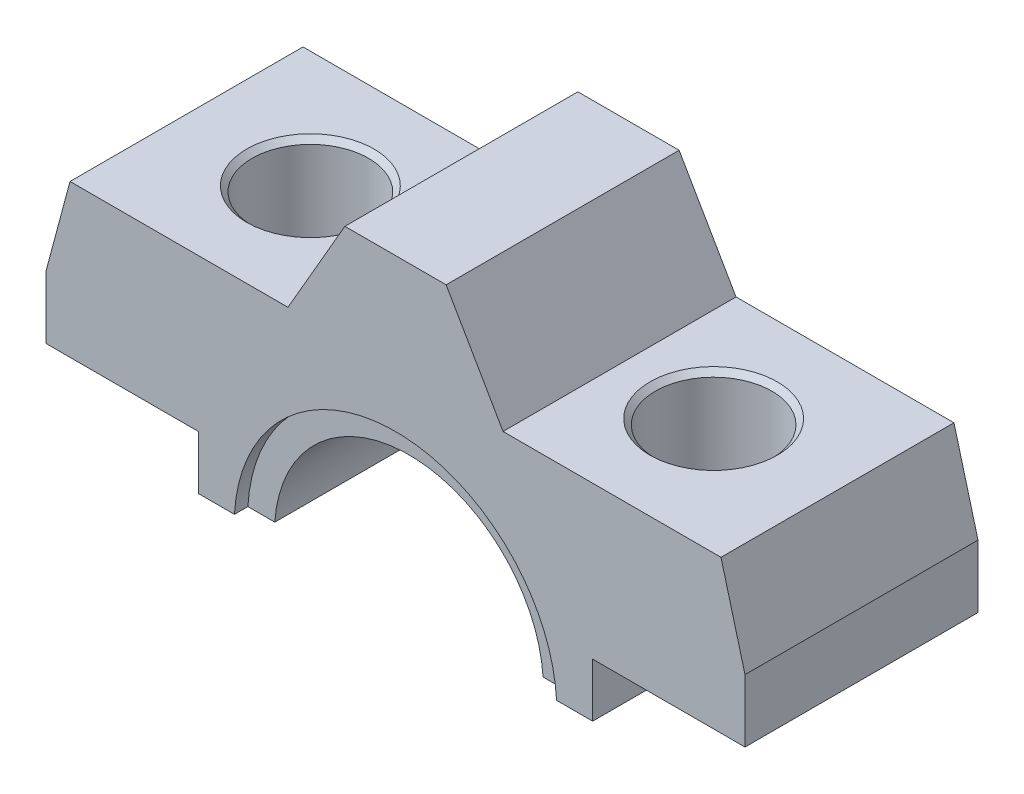
ISO-10303-21;
HEADER;
FILE_DESCRIPTION(('STEP AP214'),'2;1');
FILE_NAME('part.step','',(''),(''),'','','');
FILE_SCHEMA(('AUTOMOTIVE_DESIGN { 1 0 10303 214 1 1 1 1 }'));
ENDSEC;
DATA;
#1=APPLICATION_CONTEXT('core data for automotive mechanical design processes');
#2=APPLICATION_PROTOCOL_DEFINITION('international standard','automotive_design',2000,#1);
#3=PRODUCT_CONTEXT('',#1,'mechanical');
#4=PRODUCT('Part','Part','',(#3));
#5=PRODUCT_RELATED_PRODUCT_CATEGORY('part','',(#4));
#6=PRODUCT_DEFINITION_FORMATION('','',#4);
#7=PRODUCT_DEFINITION_CONTEXT('part definition',#1,'design');
#8=PRODUCT_DEFINITION('design','',#6,#7);
#9=PRODUCT_DEFINITION_SHAPE('','',#8);
#10=(LENGTH_UNIT() NAMED_UNIT(*) SI_UNIT(.MILLI.,.METRE.));
#11=(NAMED_UNIT(*) PLANE_ANGLE_UNIT() SI_UNIT($,.RADIAN.));
#12=(NAMED_UNIT(*) SI_UNIT($,.STERADIAN.) SOLID_ANGLE_UNIT());
#13=UNCERTAINTY_MEASURE_WITH_UNIT(LENGTH_MEASURE(1.E-05),#10,'distance_accuracy_value','');
#14=(GEOMETRIC_REPRESENTATION_CONTEXT(3) GLOBAL_UNCERTAINTY_ASSIGNED_CONTEXT((#13)) GLOBAL_UNIT_ASSIGNED_CONTEXT((#10,
#11,#12)) REPRESENTATION_CONTEXT('',''));
#15=CARTESIAN_POINT('',(0.,0.,0.));
#16=DIRECTION('',(0.,0.,1.));
#17=DIRECTION('',(1.,0.,0.));
#18=AXIS2_PLACEMENT_3D('',#15,#16,#17);
#19=CARTESIAN_POINT('',(22.,1.,-26.));
#20=DIRECTION('',(1.,0.,0.));
#21=DIRECTION('',(0.,0.,-1.));
#22=AXIS2_PLACEMENT_3D('',#19,#20,#21);
#23=PLANE('',#22);
#24=DIRECTION('',(0.,1.,0.));
#25=VECTOR('',#24,1.);
#26=CARTESIAN_POINT('',(22.,1.,-19.4807406984079));
#27=LINE('',#26,#25);
#28=CARTESIAN_POINT('',(22.,1.,-19.4807406984079));
#29=VERTEX_POINT('',#28);
#30=CARTESIAN_POINT('',(22.,7.,-19.4807406984079));
#31=VERTEX_POINT('',#30);
#32=EDGE_CURVE('E197',#29,#31,#27,.T.);
#33=ORIENTED_EDGE('',*,*,#32,.F.);
#34=DIRECTION('',(0.,0.,1.));
#35=VECTOR('',#34,1.);
#36=CARTESIAN_POINT('',(22.,1.,-26.));
#37=LINE('',#36,#35);
#38=CARTESIAN_POINT('',(22.,1.,-26.));
#39=VERTEX_POINT('',#38);
#40=EDGE_CURVE('E207',#39,#29,#37,.T.);
#41=ORIENTED_EDGE('',*,*,#40,.F.);
#42=DIRECTION('',(0.,1.,0.));
#43=VECTOR('',#42,1.);
#44=CARTESIAN_POINT('',(22.,1.,-26.));
#45=LINE('',#44,#43);
#46=CARTESIAN_POINT('',(22.,7.,-26.));
#47=VERTEX_POINT('',#46);
#48=EDGE_CURVE('E418',#39,#47,#45,.T.);
#49=ORIENTED_EDGE('',*,*,#48,.T.);
#50=DIRECTION('',(0.,0.,1.));
#51=VECTOR('',#50,1.);
#52=CARTESIAN_POINT('',(22.,7.,-26.));
#53=LINE('',#52,#51);
#54=EDGE_CURVE('E209',#47,#31,#53,.T.);
#55=ORIENTED_EDGE('',*,*,#54,.T.);
#56=EDGE_LOOP('',(#33,#41,#49,#55));
#57=FACE_BOUND('',#56,.T.);
#58=ADVANCED_FACE('F35',(#57),#23,.T.);
#59=CARTESIAN_POINT('',(-22.,7.,-26.));
#60=DIRECTION('',(-1.,0.,0.));
#61=DIRECTION('',(0.,0.,1.));
#62=AXIS2_PLACEMENT_3D('',#59,#60,#61);
#63=PLANE('',#62);
#64=DIRECTION('',(0.,1.,0.));
#65=VECTOR('',#64,1.);
#66=CARTESIAN_POINT('',(-22.,1.,-6.51925930159214));
#67=LINE('',#66,#65);
#68=CARTESIAN_POINT('',(-22.,1.,-6.51925930159214));
#69=VERTEX_POINT('',#68);
#70=CARTESIAN_POINT('',(-22.,7.,-6.51925930159214));
#71=VERTEX_POINT('',#70);
#72=EDGE_CURVE('E58',#69,#71,#67,.T.);
#73=ORIENTED_EDGE('',*,*,#72,.F.);
#74=DIRECTION('',(0.,0.,1.));
#75=VECTOR('',#74,1.);
#76=CARTESIAN_POINT('',(-22.,1.,-26.));
#77=LINE('',#76,#75);
#78=CARTESIAN_POINT('',(-22.,1.,0.));
#79=VERTEX_POINT('',#78);
#80=EDGE_CURVE('E225',#69,#79,#77,.T.);
#81=ORIENTED_EDGE('',*,*,#80,.T.);
#82=DIRECTION('',(0.,-1.,0.));
#83=VECTOR('',#82,1.);
#84=CARTESIAN_POINT('',(-22.,7.,0.));
#85=LINE('',#84,#83);
#86=CARTESIAN_POINT('',(-22.,7.,0.));
#87=VERTEX_POINT('',#86);
#88=EDGE_CURVE('E433',#87,#79,#85,.T.);
#89=ORIENTED_EDGE('',*,*,#88,.F.);
#90=DIRECTION('',(0.,0.,1.));
#91=VECTOR('',#90,1.);
#92=CARTESIAN_POINT('',(-22.,7.,-26.));
#93=LINE('',#92,#91);
#94=EDGE_CURVE('E229',#71,#87,#93,.T.);
#95=ORIENTED_EDGE('',*,*,#94,.F.);
#96=EDGE_LOOP('',(#73,#81,#89,#95));
#97=FACE_BOUND('',#96,.T.);
#98=ADVANCED_FACE('F262',(#97),#63,.T.);
#99=CARTESIAN_POINT('',(0.,0.,-26.));
#100=DIRECTION('',(0.,0.,1.));
#101=DIRECTION('',(1.,0.,0.));
#102=AXIS2_PLACEMENT_3D('',#99,#100,#101);
#103=CYLINDRICAL_SURFACE('',#102,15.);
#104=CARTESIAN_POINT('',(0.,0.,-24.5));
#105=DIRECTION('',(0.,0.,-1.));
#106=DIRECTION('',(-1.,0.,0.));
#107=AXIS2_PLACEMENT_3D('',#104,#105,#106);
#108=CIRCLE('',#107,15.);
#109=CARTESIAN_POINT('',(14.9666295470958,1.,-24.5));
#110=VERTEX_POINT('',#109);
#111=CARTESIAN_POINT('',(-14.9666295470958,1.,-24.5));
#112=VERTEX_POINT('',#111);
#113=EDGE_CURVE('E384',#110,#112,#108,.F.);
#114=ORIENTED_EDGE('',*,*,#113,.F.);
#115=DIRECTION('',(0.,0.,1.));
#116=VECTOR('',#115,1.);
#117=CARTESIAN_POINT('',(14.9666295470958,1.,-26.));
#118=LINE('',#117,#116);
#119=CARTESIAN_POINT('',(14.9666295470958,1.,-1.5));
#120=VERTEX_POINT('',#119);
#121=EDGE_CURVE('E407',#110,#120,#118,.T.);
#122=ORIENTED_EDGE('',*,*,#121,.T.);
#123=CARTESIAN_POINT('',(0.,0.,-1.5));
#124=DIRECTION('',(0.,0.,1.));
#125=DIRECTION('',(1.,0.,0.));
#126=AXIS2_PLACEMENT_3D('',#123,#124,#125);
#127=CIRCLE('',#126,15.);
#128=CARTESIAN_POINT('',(-14.9666295470958,1.,-1.50000000000001));
#129=VERTEX_POINT('',#128);
#130=EDGE_CURVE('E234',#129,#120,#127,.F.);
#131=ORIENTED_EDGE('',*,*,#130,.F.);
#132=DIRECTION('',(0.,0.,1.));
#133=VECTOR('',#132,1.);
#134=CARTESIAN_POINT('',(-14.9666295470958,1.,-26.));
#135=LINE('',#134,#133);
#136=EDGE_CURVE('E404',#129,#112,#135,.F.);
#137=ORIENTED_EDGE('',*,*,#136,.T.);
#138=EDGE_LOOP('',(#114,#122,#131,#137));
#139=FACE_BOUND('',#138,.T.);
#140=ADVANCED_FACE('F268',(#139),#103,.F.);
#141=CARTESIAN_POINT('',(-22.,1.,-26.));
#142=DIRECTION('',(0.,-1.,0.));
#143=DIRECTION('',(0.,0.,-1.));
#144=AXIS2_PLACEMENT_3D('',#141,#142,#143);
#145=PLANE('',#144);
#146=CARTESIAN_POINT('',(22.5,1.,-13.));
#147=DIRECTION('',(0.,1.,0.));
#148=DIRECTION('',(0.,0.,1.));
#149=AXIS2_PLACEMENT_3D('',#146,#147,#148);
#150=CIRCLE('',#149,6.5);
#151=CARTESIAN_POINT('',(22.,1.,-6.51925930159214));
#152=VERTEX_POINT('',#151);
#153=EDGE_CURVE('E194',#29,#152,#150,.T.);
#154=ORIENTED_EDGE('',*,*,#153,.T.);
#155=CARTESIAN_POINT('',(22.,1.,0.));
#156=VERTEX_POINT('',#155);
#157=EDGE_CURVE('E217',#152,#156,#37,.T.);
#158=ORIENTED_EDGE('',*,*,#157,.T.);
#159=DIRECTION('',(1.,0.,0.));
#160=VECTOR('',#159,1.);
#161=CARTESIAN_POINT('',(-22.,1.,0.));
#162=LINE('',#161,#160);
#163=CARTESIAN_POINT('',(17.9722007556114,1.,0.));
#164=VERTEX_POINT('',#163);
#165=EDGE_CURVE('E304',#164,#156,#162,.T.);
#166=ORIENTED_EDGE('',*,*,#165,.F.);
#167=DIRECTION('',(0.,0.,1.));
#168=VECTOR('',#167,1.);
#169=CARTESIAN_POINT('',(17.9722007556114,1.,-1.5));
#170=LINE('',#169,#168);
#171=CARTESIAN_POINT('',(17.9722007556114,1.,-1.5));
#172=VERTEX_POINT('',#171);
#173=EDGE_CURVE('E402',#172,#164,#170,.T.);
#174=ORIENTED_EDGE('',*,*,#173,.F.);
#175=DIRECTION('',(-1.,0.,0.));
#176=VECTOR('',#175,1.);
#177=CARTESIAN_POINT('',(-22.,1.,-1.5));
#178=LINE('',#177,#176);
#179=EDGE_CURVE('E397',#172,#120,#178,.T.);
#180=ORIENTED_EDGE('',*,*,#179,.T.);
#181=ORIENTED_EDGE('',*,*,#121,.F.);
#182=DIRECTION('',(1.,0.,0.));
#183=VECTOR('',#182,1.);
#184=CARTESIAN_POINT('',(-22.,1.,-24.5));
#185=LINE('',#184,#183);
#186=CARTESIAN_POINT('',(17.9722007556114,1.,-24.5));
#187=VERTEX_POINT('',#186);
#188=EDGE_CURVE('E386',#110,#187,#185,.T.);
#189=ORIENTED_EDGE('',*,*,#188,.T.);
#190=DIRECTION('',(0.,0.,-1.));
#191=VECTOR('',#190,1.);
#192=CARTESIAN_POINT('',(17.9722007556114,1.,-24.5));
#193=LINE('',#192,#191);
#194=CARTESIAN_POINT('',(17.9722007556114,1.,-26.));
#195=VERTEX_POINT('',#194);
#196=EDGE_CURVE('E382',#195,#187,#193,.F.);
#197=ORIENTED_EDGE('',*,*,#196,.F.);
#198=DIRECTION('',(1.,0.,0.));
#199=VECTOR('',#198,1.);
#200=CARTESIAN_POINT('',(-22.,1.,-26.));
#201=LINE('',#200,#199);
#202=EDGE_CURVE('E215',#195,#39,#201,.T.);
#203=ORIENTED_EDGE('',*,*,#202,.T.);
#204=ORIENTED_EDGE('',*,*,#40,.T.);
#205=EDGE_LOOP('',(#154,#158,#166,#174,#180,#181,#189,#197,#203,#204));
#206=FACE_BOUND('',#205,.T.);
#207=ADVANCED_FACE('F212',(#206),#145,.T.);
#208=CARTESIAN_POINT('',(-35.0998575495685,24.,-26.));
#209=DIRECTION('',(0.,1.,0.));
#210=DIRECTION('',(0.,0.,1.));
#211=AXIS2_PLACEMENT_3D('',#208,#209,#210);
#212=PLANE('',#211);
#213=CARTESIAN_POINT('',(-22.5,24.,-13.));
#214=DIRECTION('',(0.,1.,0.));
#215=DIRECTION('',(0.,0.,1.));
#216=AXIS2_PLACEMENT_3D('',#213,#214,#215);
#217=CIRCLE('',#216,7.09999999999998);
#218=CARTESIAN_POINT('',(-22.5,24.,-5.90000000000002));
#219=VERTEX_POINT('',#218);
#220=EDGE_CURVE('E11',#219,#219,#217,.F.);
#221=ORIENTED_EDGE('',*,*,#220,.T.);
#222=EDGE_LOOP('',(#221));
#223=FACE_BOUND('',#222,.T.);
#224=DIRECTION('',(-1.,0.,0.));
#225=VECTOR('',#224,1.);
#226=CARTESIAN_POINT('',(-35.0998575495685,24.,-26.));
#227=LINE('',#226,#225);
#228=CARTESIAN_POINT('',(-12.,24.,-26.));
#229=VERTEX_POINT('',#228);
#230=CARTESIAN_POINT('',(-36.3205080756888,24.,-26.));
#231=VERTEX_POINT('',#230);
#232=EDGE_CURVE('E233',#229,#231,#227,.T.);
#233=ORIENTED_EDGE('',*,*,#232,.T.);
#234=DIRECTION('',(0.,0.,1.));
#235=VECTOR('',#234,1.);
#236=CARTESIAN_POINT('',(-36.3205080756888,24.,-50.0416305603426));
#237=LINE('',#236,#235);
#238=CARTESIAN_POINT('',(-36.3205080756888,24.,0.));
#239=VERTEX_POINT('',#238);
#240=EDGE_CURVE('E364',#231,#239,#237,.T.);
#241=ORIENTED_EDGE('',*,*,#240,.T.);
#242=DIRECTION('',(-1.,0.,0.));
#243=VECTOR('',#242,1.);
#244=CARTESIAN_POINT('',(-35.0998575495685,24.,0.));
#245=LINE('',#244,#243);
#246=CARTESIAN_POINT('',(-12.,24.,0.));
#247=VERTEX_POINT('',#246);
#248=EDGE_CURVE('E321',#247,#239,#245,.T.);
#249=ORIENTED_EDGE('',*,*,#248,.F.);
#250=DIRECTION('',(0.,0.,1.));
#251=VECTOR('',#250,1.);
#252=CARTESIAN_POINT('',(-12.,24.,-26.));
#253=LINE('',#252,#251);
#254=EDGE_CURVE('E238',#229,#247,#253,.T.);
#255=ORIENTED_EDGE('',*,*,#254,.F.);
#256=EDGE_LOOP('',(#233,#241,#249,#255));
#257=FACE_BOUND('',#256,.T.);
#258=ADVANCED_FACE('F495',(#223,#257),#212,.T.);
#259=CARTESIAN_POINT('',(-12.,24.,-26.));
#260=DIRECTION('',(-0.866025403784442,0.499999999999995,0.));
#261=DIRECTION('',(-0.499999999999995,-0.866025403784442,0.));
#262=AXIS2_PLACEMENT_3D('',#259,#260,#261);
#263=PLANE('',#262);
#264=DIRECTION('',(-0.499999999999995,-0.866025403784442,0.));
#265=VECTOR('',#264,1.);
#266=CARTESIAN_POINT('',(-12.,24.,0.));
#267=LINE('',#266,#265);
#268=CARTESIAN_POINT('',(-5.6491470389142,35.,0.));
#269=VERTEX_POINT('',#268);
#270=EDGE_CURVE('E318',#269,#247,#267,.T.);
#271=ORIENTED_EDGE('',*,*,#270,.F.);
#272=DIRECTION('',(0.,0.,1.));
#273=VECTOR('',#272,1.);
#274=CARTESIAN_POINT('',(-5.6491470389142,35.,-26.));
#275=LINE('',#274,#273);
#276=CARTESIAN_POINT('',(-5.6491470389142,35.,-26.));
#277=VERTEX_POINT('',#276);
#278=EDGE_CURVE('E325',#277,#269,#275,.T.);
#279=ORIENTED_EDGE('',*,*,#278,.F.);
#280=DIRECTION('',(-0.499999999999995,-0.866025403784442,0.));
#281=VECTOR('',#280,1.);
#282=CARTESIAN_POINT('',(-12.,24.,-26.));
#283=LINE('',#282,#281);
#284=EDGE_CURVE('E428',#277,#229,#283,.T.);
#285=ORIENTED_EDGE('',*,*,#284,.T.);
#286=ORIENTED_EDGE('',*,*,#254,.T.);
#287=EDGE_LOOP('',(#271,#279,#285,#286));
#288=FACE_BOUND('',#287,.T.);
#289=ADVANCED_FACE('F498',(#288),#263,.T.);
#290=CARTESIAN_POINT('',(-5.6491470389142,35.,-26.));
#291=DIRECTION('',(0.,1.,0.));
#292=DIRECTION('',(0.,0.,1.));
#293=AXIS2_PLACEMENT_3D('',#290,#291,#292);
#294=PLANE('',#293);
#295=DIRECTION('',(-1.,0.,0.));
#296=VECTOR('',#295,1.);
#297=CARTESIAN_POINT('',(-5.6491470389142,35.,0.));
#298=LINE('',#297,#296);
#299=CARTESIAN_POINT('',(5.6491470389142,35.,0.));
#300=VERTEX_POINT('',#299);
#301=EDGE_CURVE('E315',#300,#269,#298,.T.);
#302=ORIENTED_EDGE('',*,*,#301,.F.);
#303=DIRECTION('',(0.,0.,1.));
#304=VECTOR('',#303,1.);
#305=CARTESIAN_POINT('',(5.6491470389142,35.,-26.));
#306=LINE('',#305,#304);
#307=CARTESIAN_POINT('',(5.6491470389142,35.,-26.));
#308=VERTEX_POINT('',#307);
#309=EDGE_CURVE('E327',#308,#300,#306,.T.);
#310=ORIENTED_EDGE('',*,*,#309,.F.);
#311=DIRECTION('',(-1.,0.,0.));
#312=VECTOR('',#311,1.);
#313=CARTESIAN_POINT('',(-5.6491470389142,35.,-26.));
#314=LINE('',#313,#312);
#315=EDGE_CURVE('E425',#308,#277,#314,.T.);
#316=ORIENTED_EDGE('',*,*,#315,.T.);
#317=ORIENTED_EDGE('',*,*,#278,.T.);
#318=EDGE_LOOP('',(#302,#310,#316,#317));
#319=FACE_BOUND('',#318,.T.);
#320=ADVANCED_FACE('F500',(#319),#294,.T.);
#321=CARTESIAN_POINT('',(5.6491470389142,35.,-26.));
#322=DIRECTION('',(0.866025403784442,0.499999999999995,0.));
#323=DIRECTION('',(-0.499999999999995,0.866025403784442,0.));
#324=AXIS2_PLACEMENT_3D('',#321,#322,#323);
#325=PLANE('',#324);
#326=DIRECTION('',(-0.499999999999995,0.866025403784442,0.));
#327=VECTOR('',#326,1.);
#328=CARTESIAN_POINT('',(5.6491470389142,35.,0.));
#329=LINE('',#328,#327);
#330=CARTESIAN_POINT('',(12.,24.,0.));
#331=VERTEX_POINT('',#330);
#332=EDGE_CURVE('E312',#331,#300,#329,.T.);
#333=ORIENTED_EDGE('',*,*,#332,.F.);
#334=DIRECTION('',(0.,0.,1.));
#335=VECTOR('',#334,1.);
#336=CARTESIAN_POINT('',(12.,24.,-26.));
#337=LINE('',#336,#335);
#338=CARTESIAN_POINT('',(12.,24.,-26.));
#339=VERTEX_POINT('',#338);
#340=EDGE_CURVE('E329',#339,#331,#337,.T.);
#341=ORIENTED_EDGE('',*,*,#340,.F.);
#342=DIRECTION('',(-0.499999999999995,0.866025403784442,0.));
#343=VECTOR('',#342,1.);
#344=CARTESIAN_POINT('',(5.6491470389142,35.,-26.));
#345=LINE('',#344,#343);
#346=EDGE_CURVE('E423',#339,#308,#345,.T.);
#347=ORIENTED_EDGE('',*,*,#346,.T.);
#348=ORIENTED_EDGE('',*,*,#309,.T.);
#349=EDGE_LOOP('',(#333,#341,#347,#348));
#350=FACE_BOUND('',#349,.T.);
#351=ADVANCED_FACE('F340',(#350),#325,.T.);
#352=CARTESIAN_POINT('',(12.,24.,-26.));
#353=DIRECTION('',(0.,1.,0.));
#354=DIRECTION('',(0.,0.,1.));
#355=AXIS2_PLACEMENT_3D('',#352,#353,#354);
#356=PLANE('',#355);
#357=CARTESIAN_POINT('',(22.5,24.,-13.));
#358=DIRECTION('',(0.,1.,0.));
#359=DIRECTION('',(0.,0.,1.));
#360=AXIS2_PLACEMENT_3D('',#357,#358,#359);
#361=CIRCLE('',#360,7.09999999999998);
#362=CARTESIAN_POINT('',(22.5,24.,-5.90000000000002));
#363=VERTEX_POINT('',#362);
#364=EDGE_CURVE('E246',#363,#363,#361,.F.);
#365=ORIENTED_EDGE('',*,*,#364,.T.);
#366=EDGE_LOOP('',(#365));
#367=FACE_BOUND('',#366,.T.);
#368=ORIENTED_EDGE('',*,*,#340,.T.);
#369=DIRECTION('',(-1.,0.,0.));
#370=VECTOR('',#369,1.);
#371=CARTESIAN_POINT('',(12.,24.,0.));
#372=LINE('',#371,#370);
#373=CARTESIAN_POINT('',(36.3205080756888,24.,0.));
#374=VERTEX_POINT('',#373);
#375=EDGE_CURVE('E297',#374,#331,#372,.T.);
#376=ORIENTED_EDGE('',*,*,#375,.F.);
#377=DIRECTION('',(0.,0.,1.));
#378=VECTOR('',#377,1.);
#379=CARTESIAN_POINT('',(36.3205080756888,24.,-50.0416305603426));
#380=LINE('',#379,#378);
#381=CARTESIAN_POINT('',(36.3205080756888,24.,-26.));
#382=VERTEX_POINT('',#381);
#383=EDGE_CURVE('E350',#382,#374,#380,.T.);
#384=ORIENTED_EDGE('',*,*,#383,.F.);
#385=DIRECTION('',(-1.,0.,0.));
#386=VECTOR('',#385,1.);
#387=CARTESIAN_POINT('',(12.,24.,-26.));
#388=LINE('',#387,#386);
#389=EDGE_CURVE('E336',#382,#339,#388,.T.);
#390=ORIENTED_EDGE('',*,*,#389,.T.);
#391=EDGE_LOOP('',(#368,#376,#384,#390));
#392=FACE_BOUND('',#391,.T.);
#393=ADVANCED_FACE('F283',(#367,#392),#356,.T.);
#394=CARTESIAN_POINT('',(22.,7.,-26.));
#395=DIRECTION('',(0.,-1.,0.));
#396=DIRECTION('',(0.,0.,-1.));
#397=AXIS2_PLACEMENT_3D('',#394,#395,#396);
#398=PLANE('',#397);
#399=CARTESIAN_POINT('',(22.5,7.,-13.));
#400=DIRECTION('',(0.,-1.,0.));
#401=DIRECTION('',(0.,0.,-1.));
#402=AXIS2_PLACEMENT_3D('',#399,#400,#401);
#403=CIRCLE('',#402,6.5);
#404=CARTESIAN_POINT('',(22.,7.,-6.51925930159214));
#405=VERTEX_POINT('',#404);
#406=EDGE_CURVE('E50',#31,#405,#403,.T.);
#407=ORIENTED_EDGE('',*,*,#406,.F.);
#408=ORIENTED_EDGE('',*,*,#54,.F.);
#409=DIRECTION('',(1.,0.,0.));
#410=VECTOR('',#409,1.);
#411=CARTESIAN_POINT('',(22.,7.,-26.));
#412=LINE('',#411,#410);
#413=CARTESIAN_POINT('',(39.,7.,-26.));
#414=VERTEX_POINT('',#413);
#415=EDGE_CURVE('E420',#47,#414,#412,.T.);
#416=ORIENTED_EDGE('',*,*,#415,.T.);
#417=DIRECTION('',(0.,0.,1.));
#418=VECTOR('',#417,1.);
#419=CARTESIAN_POINT('',(39.,7.,-26.));
#420=LINE('',#419,#418);
#421=CARTESIAN_POINT('',(39.,7.,0.));
#422=VERTEX_POINT('',#421);
#423=EDGE_CURVE('E294',#414,#422,#420,.T.);
#424=ORIENTED_EDGE('',*,*,#423,.T.);
#425=DIRECTION('',(1.,0.,0.));
#426=VECTOR('',#425,1.);
#427=CARTESIAN_POINT('',(22.,7.,0.));
#428=LINE('',#427,#426);
#429=CARTESIAN_POINT('',(22.,7.,0.));
#430=VERTEX_POINT('',#429);
#431=EDGE_CURVE('E290',#430,#422,#428,.T.);
#432=ORIENTED_EDGE('',*,*,#431,.F.);
#433=EDGE_CURVE('E216',#405,#430,#53,.T.);
#434=ORIENTED_EDGE('',*,*,#433,.F.);
#435=EDGE_LOOP('',(#407,#408,#416,#424,#432,#434));
#436=FACE_BOUND('',#435,.T.);
#437=ADVANCED_FACE('F276',(#436),#398,.T.);
#438=DIRECTION('',(0.,1.,0.));
#439=VECTOR('',#438,1.);
#440=CARTESIAN_POINT('',(22.,1.,-6.51925930159214));
#441=LINE('',#440,#439);
#442=EDGE_CURVE('E198',#405,#152,#441,.F.);
#443=ORIENTED_EDGE('',*,*,#442,.F.);
#444=ORIENTED_EDGE('',*,*,#433,.T.);
#445=DIRECTION('',(0.,1.,0.));
#446=VECTOR('',#445,1.);
#447=CARTESIAN_POINT('',(22.,1.,0.));
#448=LINE('',#447,#446);
#449=EDGE_CURVE('E298',#156,#430,#448,.T.);
#450=ORIENTED_EDGE('',*,*,#449,.F.);
#451=ORIENTED_EDGE('',*,*,#157,.F.);
#452=EDGE_LOOP('',(#443,#444,#450,#451));
#453=FACE_BOUND('',#452,.T.);
#454=ADVANCED_FACE('F264',(#453),#23,.T.);
#455=CARTESIAN_POINT('',(-22.5,1.,-13.));
#456=DIRECTION('',(0.,1.,0.));
#457=DIRECTION('',(0.,0.,1.));
#458=AXIS2_PLACEMENT_3D('',#455,#456,#457);
#459=CIRCLE('',#458,6.5);
#460=CARTESIAN_POINT('',(-22.,1.,-19.4807406984079));
#461=VERTEX_POINT('',#460);
#462=EDGE_CURVE('E473',#69,#461,#459,.T.);
#463=ORIENTED_EDGE('',*,*,#462,.T.);
#464=CARTESIAN_POINT('',(-22.,1.,-26.));
#465=VERTEX_POINT('',#464);
#466=EDGE_CURVE('E220',#465,#461,#77,.T.);
#467=ORIENTED_EDGE('',*,*,#466,.F.);
#468=CARTESIAN_POINT('',(-17.9722007556114,1.,-26.));
#469=VERTEX_POINT('',#468);
#470=EDGE_CURVE('E415',#465,#469,#201,.T.);
#471=ORIENTED_EDGE('',*,*,#470,.T.);
#472=DIRECTION('',(0.,0.,-1.));
#473=VECTOR('',#472,1.);
#474=CARTESIAN_POINT('',(-17.9722007556114,1.,-24.5));
#475=LINE('',#474,#473);
#476=CARTESIAN_POINT('',(-17.9722007556114,1.,-24.5));
#477=VERTEX_POINT('',#476);
#478=EDGE_CURVE('E379',#477,#469,#475,.T.);
#479=ORIENTED_EDGE('',*,*,#478,.F.);
#480=DIRECTION('',(1.,0.,0.));
#481=VECTOR('',#480,1.);
#482=CARTESIAN_POINT('',(-22.,1.,-24.5));
#483=LINE('',#482,#481);
#484=EDGE_CURVE('E237',#477,#112,#483,.T.);
#485=ORIENTED_EDGE('',*,*,#484,.T.);
#486=ORIENTED_EDGE('',*,*,#136,.F.);
#487=DIRECTION('',(-1.,0.,0.));
#488=VECTOR('',#487,1.);
#489=CARTESIAN_POINT('',(-22.,1.,-1.5));
#490=LINE('',#489,#488);
#491=CARTESIAN_POINT('',(-17.9722007556114,1.,-1.5));
#492=VERTEX_POINT('',#491);
#493=EDGE_CURVE('E393',#129,#492,#490,.T.);
#494=ORIENTED_EDGE('',*,*,#493,.T.);
#495=DIRECTION('',(0.,0.,1.));
#496=VECTOR('',#495,1.);
#497=CARTESIAN_POINT('',(-17.9722007556114,1.,-1.5));
#498=LINE('',#497,#496);
#499=CARTESIAN_POINT('',(-17.9722007556114,1.,0.));
#500=VERTEX_POINT('',#499);
#501=EDGE_CURVE('E400',#500,#492,#498,.F.);
#502=ORIENTED_EDGE('',*,*,#501,.F.);
#503=EDGE_CURVE('E305',#79,#500,#162,.T.);
#504=ORIENTED_EDGE('',*,*,#503,.F.);
#505=ORIENTED_EDGE('',*,*,#80,.F.);
#506=EDGE_LOOP('',(#463,#467,#471,#479,#485,#486,#494,#502,#504,#505));
#507=FACE_BOUND('',#506,.T.);
#508=ADVANCED_FACE('F275',(#507),#145,.T.);
#509=DIRECTION('',(0.,1.,0.));
#510=VECTOR('',#509,1.);
#511=CARTESIAN_POINT('',(-22.,1.,-19.4807406984079));
#512=LINE('',#511,#510);
#513=CARTESIAN_POINT('',(-22.,7.,-19.4807406984079));
#514=VERTEX_POINT('',#513);
#515=EDGE_CURVE('E471',#514,#461,#512,.F.);
#516=ORIENTED_EDGE('',*,*,#515,.F.);
#517=CARTESIAN_POINT('',(-22.,7.,-26.));
#518=VERTEX_POINT('',#517);
#519=EDGE_CURVE('E226',#518,#514,#93,.T.);
#520=ORIENTED_EDGE('',*,*,#519,.F.);
#521=DIRECTION('',(0.,-1.,0.));
#522=VECTOR('',#521,1.);
#523=CARTESIAN_POINT('',(-22.,7.,-26.));
#524=LINE('',#523,#522);
#525=EDGE_CURVE('E412',#518,#465,#524,.T.);
#526=ORIENTED_EDGE('',*,*,#525,.T.);
#527=ORIENTED_EDGE('',*,*,#466,.T.);
#528=EDGE_LOOP('',(#516,#520,#526,#527));
#529=FACE_BOUND('',#528,.T.);
#530=ADVANCED_FACE('F271',(#529),#63,.T.);
#531=CARTESIAN_POINT('',(-39.,7.,-26.));
#532=DIRECTION('',(0.,-1.,0.));
#533=DIRECTION('',(0.,0.,-1.));
#534=AXIS2_PLACEMENT_3D('',#531,#532,#533);
#535=PLANE('',#534);
#536=CARTESIAN_POINT('',(-22.5,7.,-13.));
#537=DIRECTION('',(0.,-1.,0.));
#538=DIRECTION('',(0.,0.,-1.));
#539=AXIS2_PLACEMENT_3D('',#536,#537,#538);
#540=CIRCLE('',#539,6.5);
#541=EDGE_CURVE('E241',#71,#514,#540,.T.);
#542=ORIENTED_EDGE('',*,*,#541,.F.);
#543=ORIENTED_EDGE('',*,*,#94,.T.);
#544=DIRECTION('',(1.,0.,0.));
#545=VECTOR('',#544,1.);
#546=CARTESIAN_POINT('',(-39.,7.,0.));
#547=LINE('',#546,#545);
#548=CARTESIAN_POINT('',(-39.,7.,0.));
#549=VERTEX_POINT('',#548);
#550=EDGE_CURVE('E409',#549,#87,#547,.T.);
#551=ORIENTED_EDGE('',*,*,#550,.F.);
#552=DIRECTION('',(0.,0.,1.));
#553=VECTOR('',#552,1.);
#554=CARTESIAN_POINT('',(-39.,7.,-26.));
#555=LINE('',#554,#553);
#556=CARTESIAN_POINT('',(-39.,7.,-26.));
#557=VERTEX_POINT('',#556);
#558=EDGE_CURVE('E230',#557,#549,#555,.T.);
#559=ORIENTED_EDGE('',*,*,#558,.F.);
#560=DIRECTION('',(1.,0.,0.));
#561=VECTOR('',#560,1.);
#562=CARTESIAN_POINT('',(-39.,7.,-26.));
#563=LINE('',#562,#561);
#564=EDGE_CURVE('E323',#557,#518,#563,.T.);
#565=ORIENTED_EDGE('',*,*,#564,.T.);
#566=ORIENTED_EDGE('',*,*,#519,.T.);
#567=EDGE_LOOP('',(#542,#543,#551,#559,#565,#566));
#568=FACE_BOUND('',#567,.T.);
#569=ADVANCED_FACE('F480',(#568),#535,.T.);
#570=CARTESIAN_POINT('',(0.,7.,-26.));
#571=DIRECTION('',(0.,0.,1.));
#572=DIRECTION('',(1.,0.,0.));
#573=AXIS2_PLACEMENT_3D('',#570,#571,#572);
#574=PLANE('',#573);
#575=ORIENTED_EDGE('',*,*,#346,.F.);
#576=ORIENTED_EDGE('',*,*,#389,.F.);
#577=DIRECTION('',(0.258819045102522,-0.965925826289068,0.));
#578=VECTOR('',#577,1.);
#579=CARTESIAN_POINT('',(39.,14.,-26.));
#580=LINE('',#579,#578);
#581=CARTESIAN_POINT('',(39.,14.,-26.));
#582=VERTEX_POINT('',#581);
#583=EDGE_CURVE('E355',#382,#582,#580,.T.);
#584=ORIENTED_EDGE('',*,*,#583,.T.);
#585=DIRECTION('',(0.,-1.,0.));
#586=VECTOR('',#585,1.);
#587=CARTESIAN_POINT('',(39.,7.,-26.));
#588=LINE('',#587,#586);
#589=EDGE_CURVE('E357',#582,#414,#588,.T.);
#590=ORIENTED_EDGE('',*,*,#589,.T.);
#591=ORIENTED_EDGE('',*,*,#415,.F.);
#592=ORIENTED_EDGE('',*,*,#48,.F.);
#593=ORIENTED_EDGE('',*,*,#202,.F.);
#594=CARTESIAN_POINT('',(0.,0.,-26.));
#595=DIRECTION('',(0.,0.,-1.));
#596=DIRECTION('',(-1.,0.,0.));
#597=AXIS2_PLACEMENT_3D('',#594,#595,#596);
#598=CIRCLE('',#597,18.);
#599=EDGE_CURVE('E375',#469,#195,#598,.T.);
#600=ORIENTED_EDGE('',*,*,#599,.F.);
#601=ORIENTED_EDGE('',*,*,#470,.F.);
#602=ORIENTED_EDGE('',*,*,#525,.F.);
#603=ORIENTED_EDGE('',*,*,#564,.F.);
#604=DIRECTION('',(0.,1.,0.));
#605=VECTOR('',#604,1.);
#606=CARTESIAN_POINT('',(-39.,7.,-26.));
#607=LINE('',#606,#605);
#608=CARTESIAN_POINT('',(-39.,14.,-26.));
#609=VERTEX_POINT('',#608);
#610=EDGE_CURVE('E363',#557,#609,#607,.T.);
#611=ORIENTED_EDGE('',*,*,#610,.T.);
#612=DIRECTION('',(0.258819045102522,0.965925826289068,0.));
#613=VECTOR('',#612,1.);
#614=CARTESIAN_POINT('',(-39.,14.,-26.));
#615=LINE('',#614,#613);
#616=EDGE_CURVE('E360',#609,#231,#615,.T.);
#617=ORIENTED_EDGE('',*,*,#616,.T.);
#618=ORIENTED_EDGE('',*,*,#232,.F.);
#619=ORIENTED_EDGE('',*,*,#284,.F.);
#620=ORIENTED_EDGE('',*,*,#315,.F.);
#621=EDGE_LOOP('',(#575,#576,#584,#590,#591,#592,#593,#600,#601,#602,#603,#611,#617,#618,#619,#620));
#622=FACE_BOUND('',#621,.T.);
#623=ADVANCED_FACE('F461',(#622),#574,.F.);
#624=CARTESIAN_POINT('',(0.,7.,0.));
#625=DIRECTION('',(0.,0.,1.));
#626=DIRECTION('',(1.,0.,0.));
#627=AXIS2_PLACEMENT_3D('',#624,#625,#626);
#628=PLANE('',#627);
#629=ORIENTED_EDGE('',*,*,#449,.T.);
#630=ORIENTED_EDGE('',*,*,#431,.T.);
#631=DIRECTION('',(0.,1.,0.));
#632=VECTOR('',#631,1.);
#633=CARTESIAN_POINT('',(39.,7.,0.));
#634=LINE('',#633,#632);
#635=CARTESIAN_POINT('',(39.,14.,0.));
#636=VERTEX_POINT('',#635);
#637=EDGE_CURVE('E345',#422,#636,#634,.T.);
#638=ORIENTED_EDGE('',*,*,#637,.T.);
#639=DIRECTION('',(-0.258819045102522,0.965925826289068,0.));
#640=VECTOR('',#639,1.);
#641=CARTESIAN_POINT('',(39.,14.,0.));
#642=LINE('',#641,#640);
#643=EDGE_CURVE('E344',#636,#374,#642,.T.);
#644=ORIENTED_EDGE('',*,*,#643,.T.);
#645=ORIENTED_EDGE('',*,*,#375,.T.);
#646=ORIENTED_EDGE('',*,*,#332,.T.);
#647=ORIENTED_EDGE('',*,*,#301,.T.);
#648=ORIENTED_EDGE('',*,*,#270,.T.);
#649=ORIENTED_EDGE('',*,*,#248,.T.);
#650=DIRECTION('',(-0.258819045102522,-0.965925826289068,0.));
#651=VECTOR('',#650,1.);
#652=CARTESIAN_POINT('',(-39.,14.,0.));
#653=LINE('',#652,#651);
#654=CARTESIAN_POINT('',(-39.,14.,0.));
#655=VERTEX_POINT('',#654);
#656=EDGE_CURVE('E359',#239,#655,#653,.T.);
#657=ORIENTED_EDGE('',*,*,#656,.T.);
#658=DIRECTION('',(0.,-1.,0.));
#659=VECTOR('',#658,1.);
#660=CARTESIAN_POINT('',(-39.,7.,0.));
#661=LINE('',#660,#659);
#662=EDGE_CURVE('E367',#655,#549,#661,.T.);
#663=ORIENTED_EDGE('',*,*,#662,.T.);
#664=ORIENTED_EDGE('',*,*,#550,.T.);
#665=ORIENTED_EDGE('',*,*,#88,.T.);
#666=ORIENTED_EDGE('',*,*,#503,.T.);
#667=CARTESIAN_POINT('',(0.,0.,0.));
#668=DIRECTION('',(0.,0.,1.));
#669=DIRECTION('',(1.,0.,0.));
#670=AXIS2_PLACEMENT_3D('',#667,#668,#669);
#671=CIRCLE('',#670,18.);
#672=EDGE_CURVE('E389',#164,#500,#671,.T.);
#673=ORIENTED_EDGE('',*,*,#672,.F.);
#674=ORIENTED_EDGE('',*,*,#165,.T.);
#675=EDGE_LOOP('',(#629,#630,#638,#644,#645,#646,#647,#648,#649,#657,#663,#664,#665,#666,#673,#674));
#676=FACE_BOUND('',#675,.T.);
#677=ADVANCED_FACE('F301',(#676),#628,.T.);
#678=CARTESIAN_POINT('',(0.,0.,-1.5));
#679=DIRECTION('',(0.,0.,1.));
#680=DIRECTION('',(1.,0.,0.));
#681=AXIS2_PLACEMENT_3D('',#678,#679,#680);
#682=CYLINDRICAL_SURFACE('',#681,18.);
#683=ORIENTED_EDGE('',*,*,#173,.T.);
#684=ORIENTED_EDGE('',*,*,#672,.T.);
#685=ORIENTED_EDGE('',*,*,#501,.T.);
#686=CARTESIAN_POINT('',(0.,0.,-1.5));
#687=DIRECTION('',(0.,0.,1.));
#688=DIRECTION('',(1.,0.,0.));
#689=AXIS2_PLACEMENT_3D('',#686,#687,#688);
#690=CIRCLE('',#689,18.);
#691=EDGE_CURVE('E390',#172,#492,#690,.T.);
#692=ORIENTED_EDGE('',*,*,#691,.F.);
#693=EDGE_LOOP('',(#683,#684,#685,#692));
#694=FACE_BOUND('',#693,.T.);
#695=ADVANCED_FACE('F444',(#694),#682,.F.);
#696=CARTESIAN_POINT('',(0.,0.,-1.5));
#697=DIRECTION('',(0.,0.,1.));
#698=DIRECTION('',(1.,0.,0.));
#699=AXIS2_PLACEMENT_3D('',#696,#697,#698);
#700=PLANE('',#699);
#701=ORIENTED_EDGE('',*,*,#691,.T.);
#702=ORIENTED_EDGE('',*,*,#493,.F.);
#703=ORIENTED_EDGE('',*,*,#130,.T.);
#704=ORIENTED_EDGE('',*,*,#179,.F.);
#705=EDGE_LOOP('',(#701,#702,#703,#704));
#706=FACE_BOUND('',#705,.T.);
#707=ADVANCED_FACE('F447',(#706),#700,.T.);
#708=CARTESIAN_POINT('',(0.,0.,-24.5));
#709=DIRECTION('',(0.,0.,-1.));
#710=DIRECTION('',(-1.,0.,0.));
#711=AXIS2_PLACEMENT_3D('',#708,#709,#710);
#712=CYLINDRICAL_SURFACE('',#711,18.);
#713=ORIENTED_EDGE('',*,*,#196,.T.);
#714=CARTESIAN_POINT('',(0.,0.,-24.5));
#715=DIRECTION('',(0.,0.,-1.));
#716=DIRECTION('',(-1.,0.,0.));
#717=AXIS2_PLACEMENT_3D('',#714,#715,#716);
#718=CIRCLE('',#717,18.);
#719=EDGE_CURVE('E376',#477,#187,#718,.T.);
#720=ORIENTED_EDGE('',*,*,#719,.F.);
#721=ORIENTED_EDGE('',*,*,#478,.T.);
#722=ORIENTED_EDGE('',*,*,#599,.T.);
#723=EDGE_LOOP('',(#713,#720,#721,#722));
#724=FACE_BOUND('',#723,.T.);
#725=ADVANCED_FACE('F459',(#724),#712,.F.);
#726=CARTESIAN_POINT('',(0.,0.,-24.5));
#727=DIRECTION('',(0.,0.,-1.));
#728=DIRECTION('',(-1.,0.,0.));
#729=AXIS2_PLACEMENT_3D('',#726,#727,#728);
#730=PLANE('',#729);
#731=ORIENTED_EDGE('',*,*,#113,.T.);
#732=ORIENTED_EDGE('',*,*,#484,.F.);
#733=ORIENTED_EDGE('',*,*,#719,.T.);
#734=ORIENTED_EDGE('',*,*,#188,.F.);
#735=EDGE_LOOP('',(#731,#732,#733,#734));
#736=FACE_BOUND('',#735,.T.);
#737=ADVANCED_FACE('F453',(#736),#730,.T.);
#738=CARTESIAN_POINT('',(-39.,14.,-50.0416305603426));
#739=DIRECTION('',(-0.965925826289068,0.258819045102522,0.));
#740=DIRECTION('',(-0.258819045102522,-0.965925826289068,0.));
#741=AXIS2_PLACEMENT_3D('',#738,#739,#740);
#742=PLANE('',#741);
#743=ORIENTED_EDGE('',*,*,#616,.F.);
#744=DIRECTION('',(0.,0.,1.));
#745=VECTOR('',#744,1.);
#746=CARTESIAN_POINT('',(-39.,14.,-50.0416305603426));
#747=LINE('',#746,#745);
#748=EDGE_CURVE('E370',#609,#655,#747,.T.);
#749=ORIENTED_EDGE('',*,*,#748,.T.);
#750=ORIENTED_EDGE('',*,*,#656,.F.);
#751=ORIENTED_EDGE('',*,*,#240,.F.);
#752=EDGE_LOOP('',(#743,#749,#750,#751));
#753=FACE_BOUND('',#752,.T.);
#754=ADVANCED_FACE('F490',(#753),#742,.T.);
#755=CARTESIAN_POINT('',(-39.,7.,-50.0416305603426));
#756=DIRECTION('',(-1.,0.,0.));
#757=DIRECTION('',(0.,0.,1.));
#758=AXIS2_PLACEMENT_3D('',#755,#756,#757);
#759=PLANE('',#758);
#760=ORIENTED_EDGE('',*,*,#610,.F.);
#761=ORIENTED_EDGE('',*,*,#558,.T.);
#762=ORIENTED_EDGE('',*,*,#662,.F.);
#763=ORIENTED_EDGE('',*,*,#748,.F.);
#764=EDGE_LOOP('',(#760,#761,#762,#763));
#765=FACE_BOUND('',#764,.T.);
#766=ADVANCED_FACE('F483',(#765),#759,.T.);
#767=CARTESIAN_POINT('',(39.,14.,-50.0416305603426));
#768=DIRECTION('',(0.965925826289068,0.258819045102522,0.));
#769=DIRECTION('',(-0.258819045102522,0.965925826289068,0.));
#770=AXIS2_PLACEMENT_3D('',#767,#768,#769);
#771=PLANE('',#770);
#772=ORIENTED_EDGE('',*,*,#583,.F.);
#773=ORIENTED_EDGE('',*,*,#383,.T.);
#774=ORIENTED_EDGE('',*,*,#643,.F.);
#775=DIRECTION('',(0.,0.,1.));
#776=VECTOR('',#775,1.);
#777=CARTESIAN_POINT('',(39.,14.,-50.0416305603426));
#778=LINE('',#777,#776);
#779=EDGE_CURVE('E348',#582,#636,#778,.T.);
#780=ORIENTED_EDGE('',*,*,#779,.F.);
#781=EDGE_LOOP('',(#772,#773,#774,#780));
#782=FACE_BOUND('',#781,.T.);
#783=ADVANCED_FACE('F468',(#782),#771,.T.);
#784=CARTESIAN_POINT('',(39.,7.,-50.0416305603426));
#785=DIRECTION('',(1.,0.,0.));
#786=DIRECTION('',(0.,0.,-1.));
#787=AXIS2_PLACEMENT_3D('',#784,#785,#786);
#788=PLANE('',#787);
#789=ORIENTED_EDGE('',*,*,#589,.F.);
#790=ORIENTED_EDGE('',*,*,#779,.T.);
#791=ORIENTED_EDGE('',*,*,#637,.F.);
#792=ORIENTED_EDGE('',*,*,#423,.F.);
#793=EDGE_LOOP('',(#789,#790,#791,#792));
#794=FACE_BOUND('',#793,.T.);
#795=ADVANCED_FACE('F467',(#794),#788,.T.);
#796=CARTESIAN_POINT('',(-22.5,1.,-13.));
#797=DIRECTION('',(0.,1.,0.));
#798=DIRECTION('',(0.,0.,1.));
#799=AXIS2_PLACEMENT_3D('',#796,#797,#798);
#800=CYLINDRICAL_SURFACE('',#799,6.5);
#801=CARTESIAN_POINT('',(-22.5,23.4,-13.));
#802=DIRECTION('',(0.,1.,0.));
#803=DIRECTION('',(0.,0.,1.));
#804=AXIS2_PLACEMENT_3D('',#801,#802,#803);
#805=CIRCLE('',#804,6.5);
#806=CARTESIAN_POINT('',(-22.5,23.4,-6.5));
#807=VERTEX_POINT('',#806);
#808=EDGE_CURVE('E43',#807,#807,#805,.T.);
#809=ORIENTED_EDGE('',*,*,#808,.T.);
#810=EDGE_LOOP('',(#809));
#811=FACE_BOUND('',#810,.T.);
#812=ORIENTED_EDGE('',*,*,#72,.T.);
#813=ORIENTED_EDGE('',*,*,#541,.T.);
#814=ORIENTED_EDGE('',*,*,#515,.T.);
#815=ORIENTED_EDGE('',*,*,#462,.F.);
#816=EDGE_LOOP('',(#812,#813,#814,#815));
#817=FACE_BOUND('',#816,.T.);
#818=ADVANCED_FACE('F251',(#811,#817),#800,.F.);
#819=CARTESIAN_POINT('',(22.5,1.,-13.));
#820=DIRECTION('',(0.,1.,0.));
#821=DIRECTION('',(0.,0.,1.));
#822=AXIS2_PLACEMENT_3D('',#819,#820,#821);
#823=CYLINDRICAL_SURFACE('',#822,6.5);
#824=CARTESIAN_POINT('',(22.5,23.4,-13.));
#825=DIRECTION('',(0.,1.,0.));
#826=DIRECTION('',(0.,0.,1.));
#827=AXIS2_PLACEMENT_3D('',#824,#825,#826);
#828=CIRCLE('',#827,6.5);
#829=CARTESIAN_POINT('',(22.5,23.4,-6.5));
#830=VERTEX_POINT('',#829);
#831=EDGE_CURVE('E210',#830,#830,#828,.T.);
#832=ORIENTED_EDGE('',*,*,#831,.T.);
#833=EDGE_LOOP('',(#832));
#834=FACE_BOUND('',#833,.T.);
#835=ORIENTED_EDGE('',*,*,#32,.T.);
#836=ORIENTED_EDGE('',*,*,#406,.T.);
#837=ORIENTED_EDGE('',*,*,#442,.T.);
#838=ORIENTED_EDGE('',*,*,#153,.F.);
#839=EDGE_LOOP('',(#835,#836,#837,#838));
#840=FACE_BOUND('',#839,.T.);
#841=ADVANCED_FACE('F196',(#834,#840),#823,.F.);
#842=CARTESIAN_POINT('',(22.5,23.4,-13.));
#843=DIRECTION('',(0.,1.,0.));
#844=DIRECTION('',(0.,0.,1.));
#845=AXIS2_PLACEMENT_3D('',#842,#843,#844);
#846=CONICAL_SURFACE('',#845,6.5,0.78539816339745);
#847=ORIENTED_EDGE('',*,*,#364,.F.);
#848=EDGE_LOOP('',(#847));
#849=FACE_BOUND('',#848,.T.);
#850=ORIENTED_EDGE('',*,*,#831,.F.);
#851=EDGE_LOOP('',(#850));
#852=FACE_BOUND('',#851,.T.);
#853=ADVANCED_FACE('F254',(#849,#852),#846,.F.);
#854=CARTESIAN_POINT('',(-22.5,23.4,-13.));
#855=DIRECTION('',(0.,1.,0.));
#856=DIRECTION('',(0.,0.,1.));
#857=AXIS2_PLACEMENT_3D('',#854,#855,#856);
#858=CONICAL_SURFACE('',#857,6.5,0.78539816339745);
#859=ORIENTED_EDGE('',*,*,#220,.F.);
#860=EDGE_LOOP('',(#859));
#861=FACE_BOUND('',#860,.T.);
#862=ORIENTED_EDGE('',*,*,#808,.F.);
#863=EDGE_LOOP('',(#862));
#864=FACE_BOUND('',#863,.T.);
#865=ADVANCED_FACE('F37',(#861,#864),#858,.F.);
#866=CLOSED_SHELL('',(#58,#98,#140,#207,#258,#289,#320,#351,#393,#437,#454,#508,#530,#569,#623,
#677,#695,#707,#725,#737,#754,#766,#783,#795,#818,#841,#853,#865));
#867=MANIFOLD_SOLID_BREP('B2',#866);
#868=ADVANCED_BREP_SHAPE_REPRESENTATION('',(#18,#867),#14);
#869=SHAPE_DEFINITION_REPRESENTATION(#9,#868);
ENDSEC;
END-ISO-10303-21;
